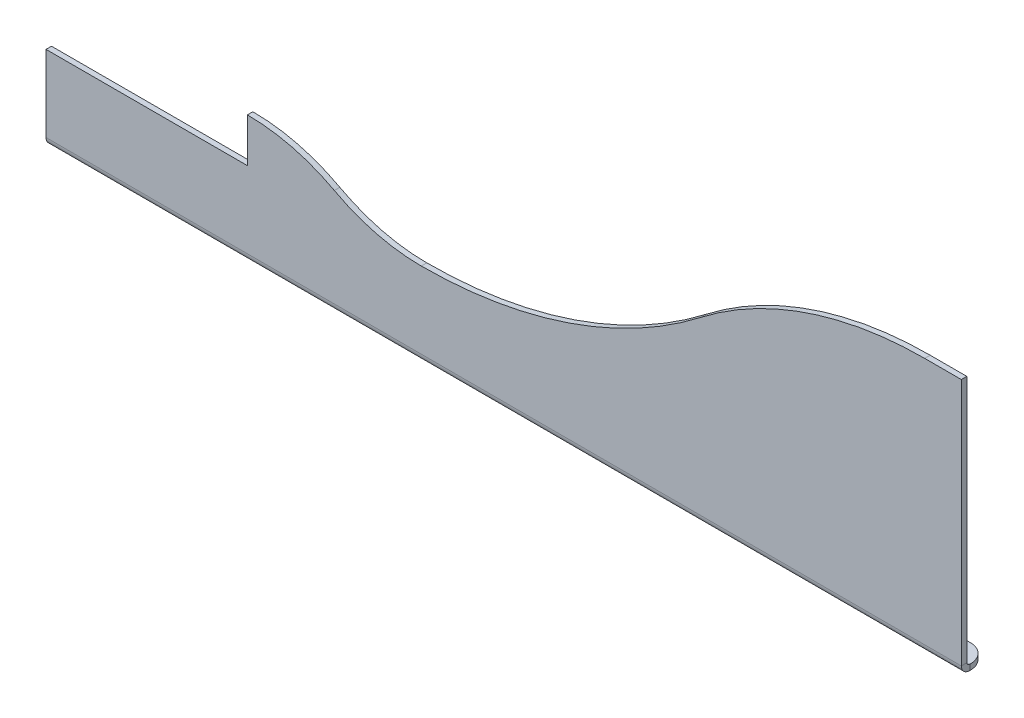
ISO-10303-21;
HEADER;
FILE_DESCRIPTION(('STEP AP214'),'2;1');
FILE_NAME('part.step','',(''),(''),'','','');
FILE_SCHEMA(('AUTOMOTIVE_DESIGN { 1 0 10303 214 1 1 1 1 }'));
ENDSEC;
DATA;
#1=APPLICATION_CONTEXT('core data for automotive mechanical design processes');
#2=APPLICATION_PROTOCOL_DEFINITION('international standard','automotive_design',2000,#1);
#3=PRODUCT_CONTEXT('',#1,'mechanical');
#4=PRODUCT('Part','Part','',(#3));
#5=PRODUCT_RELATED_PRODUCT_CATEGORY('part','',(#4));
#6=PRODUCT_DEFINITION_FORMATION('','',#4);
#7=PRODUCT_DEFINITION_CONTEXT('part definition',#1,'design');
#8=PRODUCT_DEFINITION('design','',#6,#7);
#9=PRODUCT_DEFINITION_SHAPE('','',#8);
#10=(LENGTH_UNIT() NAMED_UNIT(*) SI_UNIT(.MILLI.,.METRE.));
#11=(NAMED_UNIT(*) PLANE_ANGLE_UNIT() SI_UNIT($,.RADIAN.));
#12=(NAMED_UNIT(*) SI_UNIT($,.STERADIAN.) SOLID_ANGLE_UNIT());
#13=UNCERTAINTY_MEASURE_WITH_UNIT(LENGTH_MEASURE(1.E-05),#10,'distance_accuracy_value','');
#14=(GEOMETRIC_REPRESENTATION_CONTEXT(3) GLOBAL_UNCERTAINTY_ASSIGNED_CONTEXT((#13)) GLOBAL_UNIT_ASSIGNED_CONTEXT((#10,
#11,#12)) REPRESENTATION_CONTEXT('',''));
#15=CARTESIAN_POINT('',(0.,0.,0.));
#16=DIRECTION('',(0.,0.,1.));
#17=DIRECTION('',(1.,0.,0.));
#18=AXIS2_PLACEMENT_3D('',#15,#16,#17);
#19=CARTESIAN_POINT('',(-4.10775996457205,21.0198586262498,-3.00000000000002));
#20=DIRECTION('',(-1.,0.,0.));
#21=DIRECTION('',(0.,0.,1.));
#22=AXIS2_PLACEMENT_3D('',#19,#20,#21);
#23=PLANE('',#22);
#24=DIRECTION('',(0.,0.,-1.));
#25=VECTOR('',#24,1.);
#26=CARTESIAN_POINT('',(-4.10775996457205,24.0198586262498,-1.00613961606655E-13));
#27=LINE('',#26,#25);
#28=CARTESIAN_POINT('',(-4.10775996457205,24.0198586262498,-5.00000000000004));
#29=VERTEX_POINT('',#28);
#30=CARTESIAN_POINT('',(-4.10775996457202,24.0198586262498,-4.5));
#31=VERTEX_POINT('',#30);
#32=EDGE_CURVE('E221',#29,#31,#27,.F.);
#33=ORIENTED_EDGE('',*,*,#32,.F.);
#34=DIRECTION('',(0.,-1.,0.));
#35=VECTOR('',#34,1.);
#36=CARTESIAN_POINT('',(-4.10775996457205,21.0198586262498,-5.00000000000002));
#37=LINE('',#36,#35);
#38=CARTESIAN_POINT('',(-4.10775996457205,21.0198586262498,-5.00000000000002));
#39=VERTEX_POINT('',#38);
#40=EDGE_CURVE('E440',#29,#39,#37,.T.);
#41=ORIENTED_EDGE('',*,*,#40,.T.);
#42=DIRECTION('',(0.,0.,1.));
#43=VECTOR('',#42,1.);
#44=CARTESIAN_POINT('',(-4.10775996457205,21.0198586262498,-3.00000000000002));
#45=LINE('',#44,#43);
#46=CARTESIAN_POINT('',(-4.10775996457204,21.0198586262498,-4.50000000000002));
#47=VERTEX_POINT('',#46);
#48=EDGE_CURVE('E81',#39,#47,#45,.T.);
#49=ORIENTED_EDGE('',*,*,#48,.T.);
#50=DIRECTION('',(0.,-1.,0.));
#51=VECTOR('',#50,1.);
#52=CARTESIAN_POINT('',(-4.10775996457202,24.0198586262498,-4.50000000000004));
#53=LINE('',#52,#51);
#54=EDGE_CURVE('E219',#31,#47,#53,.T.);
#55=ORIENTED_EDGE('',*,*,#54,.F.);
#56=EDGE_LOOP('',(#33,#41,#49,#55));
#57=FACE_BOUND('',#56,.T.);
#58=ADVANCED_FACE('F59',(#57),#23,.T.);
#59=CARTESIAN_POINT('',(495.892240035428,21.0198586262497,-55.0000000000001));
#60=DIRECTION('',(1.,0.,0.));
#61=DIRECTION('',(0.,0.,-1.));
#62=AXIS2_PLACEMENT_3D('',#59,#60,#61);
#63=PLANE('',#62);
#64=DIRECTION('',(0.,0.,-1.));
#65=VECTOR('',#64,1.);
#66=CARTESIAN_POINT('',(495.892240035428,21.0198586262497,-55.0000000000001));
#67=LINE('',#66,#65);
#68=CARTESIAN_POINT('',(495.892240035428,21.0198586262498,-4.50000000000002));
#69=VERTEX_POINT('',#68);
#70=CARTESIAN_POINT('',(495.892240035428,21.0198586262498,-4.99999999999996));
#71=VERTEX_POINT('',#70);
#72=EDGE_CURVE('E74',#69,#71,#67,.T.);
#73=ORIENTED_EDGE('',*,*,#72,.T.);
#74=DIRECTION('',(0.,-1.,0.));
#75=VECTOR('',#74,1.);
#76=CARTESIAN_POINT('',(495.892240035428,24.0198586262498,-4.99999999999998));
#77=LINE('',#76,#75);
#78=CARTESIAN_POINT('',(495.892240035428,24.0198586262498,-4.99999999999998));
#79=VERTEX_POINT('',#78);
#80=EDGE_CURVE('E421',#71,#79,#77,.F.);
#81=ORIENTED_EDGE('',*,*,#80,.T.);
#82=DIRECTION('',(0.,0.,1.));
#83=VECTOR('',#82,1.);
#84=CARTESIAN_POINT('',(495.892240035428,24.0198586262498,-1.00613961606655E-13));
#85=LINE('',#84,#83);
#86=CARTESIAN_POINT('',(495.892240035428,24.0198586262498,-4.50000000000003));
#87=VERTEX_POINT('',#86);
#88=EDGE_CURVE('E388',#87,#79,#85,.F.);
#89=ORIENTED_EDGE('',*,*,#88,.F.);
#90=DIRECTION('',(0.,-1.,0.));
#91=VECTOR('',#90,1.);
#92=CARTESIAN_POINT('',(495.892240035428,21.0198586262498,-4.50000000000001));
#93=LINE('',#92,#91);
#94=EDGE_CURVE('E13',#87,#69,#93,.T.);
#95=ORIENTED_EDGE('',*,*,#94,.T.);
#96=EDGE_LOOP('',(#73,#81,#89,#95));
#97=FACE_BOUND('',#96,.T.);
#98=ADVANCED_FACE('F506',(#97),#63,.T.);
#99=CARTESIAN_POINT('',(0.,21.0198586262499,0.));
#100=DIRECTION('',(0.,-1.,0.));
#101=DIRECTION('',(0.,0.,-1.));
#102=AXIS2_PLACEMENT_3D('',#99,#100,#101);
#103=PLANE('',#102);
#104=DIRECTION('',(-1.,0.,0.));
#105=VECTOR('',#104,1.);
#106=CARTESIAN_POINT('',(495.892240035428,21.0198586262498,-15.));
#107=LINE('',#106,#105);
#108=CARTESIAN_POINT('',(485.892240035428,21.0198586262498,-15.));
#109=VERTEX_POINT('',#108);
#110=CARTESIAN_POINT('',(308.252919810426,21.0198586262498,-15.));
#111=VERTEX_POINT('',#110);
#112=EDGE_CURVE('E357',#109,#111,#107,.T.);
#113=ORIENTED_EDGE('',*,*,#112,.F.);
#114=CARTESIAN_POINT('',(485.892240035428,21.0198586262498,-4.99999999999997));
#115=DIRECTION('',(0.,-1.,0.));
#116=DIRECTION('',(0.,0.,-1.));
#117=AXIS2_PLACEMENT_3D('',#114,#115,#116);
#118=CIRCLE('',#117,10.);
#119=EDGE_CURVE('E419',#109,#71,#118,.T.);
#120=ORIENTED_EDGE('',*,*,#119,.T.);
#121=ORIENTED_EDGE('',*,*,#72,.F.);
#122=DIRECTION('',(-1.,0.,0.));
#123=VECTOR('',#122,1.);
#124=CARTESIAN_POINT('',(0.,21.0198586262498,-4.50000000000002));
#125=LINE('',#124,#123);
#126=EDGE_CURVE('E67',#69,#47,#125,.T.);
#127=ORIENTED_EDGE('',*,*,#126,.T.);
#128=ORIENTED_EDGE('',*,*,#48,.F.);
#129=CARTESIAN_POINT('',(5.89224003542795,21.0198586262498,-5.00000000000002));
#130=DIRECTION('',(0.,-1.,0.));
#131=DIRECTION('',(0.,0.,-1.));
#132=AXIS2_PLACEMENT_3D('',#129,#130,#131);
#133=CIRCLE('',#132,10.);
#134=CARTESIAN_POINT('',(5.89224003542795,21.0198586262498,-15.));
#135=VERTEX_POINT('',#134);
#136=EDGE_CURVE('E413',#39,#135,#133,.T.);
#137=ORIENTED_EDGE('',*,*,#136,.T.);
#138=DIRECTION('',(-1.,0.,0.));
#139=VECTOR('',#138,1.);
#140=CARTESIAN_POINT('',(-4.10775996457205,21.0198586262498,-15.));
#141=LINE('',#140,#139);
#142=CARTESIAN_POINT('',(183.53156026043,21.0198586262498,-15.));
#143=VERTEX_POINT('',#142);
#144=EDGE_CURVE('E343',#143,#135,#141,.T.);
#145=ORIENTED_EDGE('',*,*,#144,.F.);
#146=CARTESIAN_POINT('',(183.53156026043,21.0198586262497,-35.));
#147=DIRECTION('',(0.,-1.,0.));
#148=DIRECTION('',(0.,0.,-1.));
#149=AXIS2_PLACEMENT_3D('',#146,#147,#148);
#150=CIRCLE('',#149,20.);
#151=CARTESIAN_POINT('',(201.420104080428,21.0198586262498,-26.0557280900009));
#152=VERTEX_POINT('',#151);
#153=EDGE_CURVE('E339',#152,#143,#150,.T.);
#154=ORIENTED_EDGE('',*,*,#153,.F.);
#155=DIRECTION('',(-0.447213595499958,0.,0.894427190999916));
#156=VECTOR('',#155,1.);
#157=CARTESIAN_POINT('',(201.420104080428,21.0198586262498,-26.0557280900009));
#158=LINE('',#157,#156);
#159=CARTESIAN_POINT('',(213.128308012928,21.0198586262497,-49.4721359549997));
#160=VERTEX_POINT('',#159);
#161=EDGE_CURVE('E337',#160,#152,#158,.T.);
#162=ORIENTED_EDGE('',*,*,#161,.F.);
#163=CARTESIAN_POINT('',(222.072579922927,21.0198586262497,-45.0000000000001));
#164=DIRECTION('',(0.,-1.,0.));
#165=DIRECTION('',(0.,0.,-1.));
#166=AXIS2_PLACEMENT_3D('',#163,#164,#165);
#167=CIRCLE('',#166,10.);
#168=CARTESIAN_POINT('',(222.072579922927,21.0198586262497,-55.0000000000001));
#169=VERTEX_POINT('',#168);
#170=EDGE_CURVE('E415',#160,#169,#167,.T.);
#171=ORIENTED_EDGE('',*,*,#170,.T.);
#172=DIRECTION('',(-1.,0.,0.));
#173=VECTOR('',#172,1.);
#174=CARTESIAN_POINT('',(-4.10775996457205,21.0198586262497,-55.));
#175=LINE('',#174,#173);
#176=CARTESIAN_POINT('',(269.711900147929,21.0198586262497,-55.0000000000001));
#177=VERTEX_POINT('',#176);
#178=EDGE_CURVE('E382',#177,#169,#175,.T.);
#179=ORIENTED_EDGE('',*,*,#178,.F.);
#180=CARTESIAN_POINT('',(269.711900147929,21.0198586262497,-45.0000000000001));
#181=DIRECTION('',(0.,-1.,0.));
#182=DIRECTION('',(0.,0.,-1.));
#183=AXIS2_PLACEMENT_3D('',#180,#181,#182);
#184=CIRCLE('',#183,10.);
#185=CARTESIAN_POINT('',(278.656172057928,21.0198586262497,-49.4721359549996));
#186=VERTEX_POINT('',#185);
#187=EDGE_CURVE('E417',#177,#186,#184,.T.);
#188=ORIENTED_EDGE('',*,*,#187,.T.);
#189=DIRECTION('',(-0.447213595499958,0.,-0.894427190999916));
#190=VECTOR('',#189,1.);
#191=CARTESIAN_POINT('',(290.364375990428,21.0198586262498,-26.0557280900009));
#192=LINE('',#191,#190);
#193=CARTESIAN_POINT('',(290.364375990428,21.0198586262498,-26.0557280900009));
#194=VERTEX_POINT('',#193);
#195=EDGE_CURVE('E354',#194,#186,#192,.T.);
#196=ORIENTED_EDGE('',*,*,#195,.F.);
#197=CARTESIAN_POINT('',(308.252919810426,21.0198586262497,-35.));
#198=DIRECTION('',(0.,-1.,0.));
#199=DIRECTION('',(0.,0.,1.));
#200=AXIS2_PLACEMENT_3D('',#197,#198,#199);
#201=CIRCLE('',#200,20.);
#202=EDGE_CURVE('E263',#111,#194,#201,.T.);
#203=ORIENTED_EDGE('',*,*,#202,.F.);
#204=EDGE_LOOP('',(#113,#120,#121,#127,#128,#137,#145,#154,#162,#171,#179,#188,#196,#203));
#205=FACE_BOUND('',#204,.T.);
#206=CARTESIAN_POINT('',(228.214570505764,21.0198586262498,-12.0723304703364));
#207=DIRECTION('',(0.,-1.,0.));
#208=DIRECTION('',(0.,0.,-1.));
#209=AXIS2_PLACEMENT_3D('',#206,#207,#208);
#210=CIRCLE('',#209,3.09999999999993);
#211=CARTESIAN_POINT('',(228.214570505764,21.0198586262498,-15.1723304703363));
#212=VERTEX_POINT('',#211);
#213=EDGE_CURVE('E371',#212,#212,#210,.T.);
#214=ORIENTED_EDGE('',*,*,#213,.F.);
#215=EDGE_LOOP('',(#214));
#216=FACE_BOUND('',#215,.T.);
#217=CARTESIAN_POINT('',(263.569909565092,21.0198586262497,-47.4276695296637));
#218=DIRECTION('',(0.,-1.,0.));
#219=DIRECTION('',(0.,0.,1.));
#220=AXIS2_PLACEMENT_3D('',#217,#218,#219);
#221=CIRCLE('',#220,3.09999999999993);
#222=CARTESIAN_POINT('',(263.569909565092,21.0198586262497,-44.3276695296638));
#223=VERTEX_POINT('',#222);
#224=EDGE_CURVE('E370',#223,#223,#221,.T.);
#225=ORIENTED_EDGE('',*,*,#224,.F.);
#226=EDGE_LOOP('',(#225));
#227=FACE_BOUND('',#226,.T.);
#228=CARTESIAN_POINT('',(228.214570505764,21.0198586262497,-47.4276695296637));
#229=DIRECTION('',(0.,-1.,0.));
#230=DIRECTION('',(0.,0.,1.));
#231=AXIS2_PLACEMENT_3D('',#228,#229,#230);
#232=CIRCLE('',#231,3.09999999999999);
#233=CARTESIAN_POINT('',(228.214570505764,21.0198586262497,-44.3276695296638));
#234=VERTEX_POINT('',#233);
#235=EDGE_CURVE('E367',#234,#234,#232,.T.);
#236=ORIENTED_EDGE('',*,*,#235,.F.);
#237=EDGE_LOOP('',(#236));
#238=FACE_BOUND('',#237,.T.);
#239=CARTESIAN_POINT('',(263.569909565092,21.0198586262498,-12.0723304703364));
#240=DIRECTION('',(0.,-1.,0.));
#241=DIRECTION('',(0.,0.,-1.));
#242=AXIS2_PLACEMENT_3D('',#239,#240,#241);
#243=CIRCLE('',#242,3.09999999999993);
#244=CARTESIAN_POINT('',(263.569909565092,21.0198586262498,-15.1723304703363));
#245=VERTEX_POINT('',#244);
#246=EDGE_CURVE('E374',#245,#245,#243,.T.);
#247=ORIENTED_EDGE('',*,*,#246,.F.);
#248=EDGE_LOOP('',(#247));
#249=FACE_BOUND('',#248,.T.);
#250=ADVANCED_FACE('F444',(#205,#216,#227,#238,#249),#103,.T.);
#251=CARTESIAN_POINT('',(0.,24.0198586262498,-1.00613961606655E-13));
#252=DIRECTION('',(0.,-1.,0.));
#253=DIRECTION('',(0.,0.,-1.));
#254=AXIS2_PLACEMENT_3D('',#251,#252,#253);
#255=PLANE('',#254);
#256=CARTESIAN_POINT('',(228.214570505764,24.0198586262498,-12.0723304703364));
#257=DIRECTION('',(0.,-1.,0.));
#258=DIRECTION('',(0.,0.,-1.));
#259=AXIS2_PLACEMENT_3D('',#256,#257,#258);
#260=CIRCLE('',#259,3.09999999999993);
#261=CARTESIAN_POINT('',(228.214570505764,24.0198586262498,-15.1723304703363));
#262=VERTEX_POINT('',#261);
#263=EDGE_CURVE('E390',#262,#262,#260,.T.);
#264=ORIENTED_EDGE('',*,*,#263,.T.);
#265=EDGE_LOOP('',(#264));
#266=FACE_BOUND('',#265,.T.);
#267=CARTESIAN_POINT('',(263.569909565092,24.0198586262497,-47.4276695296637));
#268=DIRECTION('',(0.,-1.,0.));
#269=DIRECTION('',(0.,0.,-1.));
#270=AXIS2_PLACEMENT_3D('',#267,#268,#269);
#271=CIRCLE('',#270,3.09999999999993);
#272=CARTESIAN_POINT('',(263.569909565092,24.0198586262497,-50.5276695296636));
#273=VERTEX_POINT('',#272);
#274=EDGE_CURVE('E396',#273,#273,#271,.T.);
#275=ORIENTED_EDGE('',*,*,#274,.T.);
#276=EDGE_LOOP('',(#275));
#277=FACE_BOUND('',#276,.T.);
#278=CARTESIAN_POINT('',(228.214570505764,24.0198586262497,-47.4276695296637));
#279=DIRECTION('',(0.,-1.,0.));
#280=DIRECTION('',(0.,0.,-1.));
#281=AXIS2_PLACEMENT_3D('',#278,#279,#280);
#282=CIRCLE('',#281,3.09999999999999);
#283=CARTESIAN_POINT('',(228.214570505764,24.0198586262497,-50.5276695296637));
#284=VERTEX_POINT('',#283);
#285=EDGE_CURVE('E393',#284,#284,#282,.T.);
#286=ORIENTED_EDGE('',*,*,#285,.T.);
#287=EDGE_LOOP('',(#286));
#288=FACE_BOUND('',#287,.T.);
#289=CARTESIAN_POINT('',(263.569909565092,24.0198586262498,-12.0723304703364));
#290=DIRECTION('',(0.,-1.,0.));
#291=DIRECTION('',(0.,0.,-1.));
#292=AXIS2_PLACEMENT_3D('',#289,#290,#291);
#293=CIRCLE('',#292,3.09999999999993);
#294=CARTESIAN_POINT('',(263.569909565092,24.0198586262498,-15.1723304703363));
#295=VERTEX_POINT('',#294);
#296=EDGE_CURVE('E379',#295,#295,#293,.T.);
#297=ORIENTED_EDGE('',*,*,#296,.T.);
#298=EDGE_LOOP('',(#297));
#299=FACE_BOUND('',#298,.T.);
#300=ORIENTED_EDGE('',*,*,#88,.T.);
#301=CARTESIAN_POINT('',(485.892240035428,24.0198586262498,-4.99999999999998));
#302=DIRECTION('',(0.,-1.,0.));
#303=DIRECTION('',(0.,0.,-1.));
#304=AXIS2_PLACEMENT_3D('',#301,#302,#303);
#305=CIRCLE('',#304,10.);
#306=CARTESIAN_POINT('',(485.892240035428,24.0198586262498,-15.));
#307=VERTEX_POINT('',#306);
#308=EDGE_CURVE('E428',#79,#307,#305,.F.);
#309=ORIENTED_EDGE('',*,*,#308,.T.);
#310=DIRECTION('',(-1.,0.,0.));
#311=VECTOR('',#310,1.);
#312=CARTESIAN_POINT('',(0.,24.0198586262498,-15.0000000000001));
#313=LINE('',#312,#311);
#314=CARTESIAN_POINT('',(308.252919810426,24.0198586262498,-15.));
#315=VERTEX_POINT('',#314);
#316=EDGE_CURVE('E403',#307,#315,#313,.T.);
#317=ORIENTED_EDGE('',*,*,#316,.T.);
#318=CARTESIAN_POINT('',(308.252919810426,24.0198586262497,-35.));
#319=DIRECTION('',(0.,-1.,0.));
#320=DIRECTION('',(0.,0.,-1.));
#321=AXIS2_PLACEMENT_3D('',#318,#319,#320);
#322=CIRCLE('',#321,20.);
#323=CARTESIAN_POINT('',(290.364375990428,24.0198586262497,-26.0557280900009));
#324=VERTEX_POINT('',#323);
#325=EDGE_CURVE('E381',#315,#324,#322,.T.);
#326=ORIENTED_EDGE('',*,*,#325,.T.);
#327=DIRECTION('',(-0.447213595499958,0.,-0.894427190999916));
#328=VECTOR('',#327,1.);
#329=CARTESIAN_POINT('',(242.713792028342,24.0198586262494,-121.356896014171));
#330=LINE('',#329,#328);
#331=CARTESIAN_POINT('',(278.656172057928,24.0198586262497,-49.4721359549996));
#332=VERTEX_POINT('',#331);
#333=EDGE_CURVE('E349',#324,#332,#330,.T.);
#334=ORIENTED_EDGE('',*,*,#333,.T.);
#335=CARTESIAN_POINT('',(269.711900147929,24.0198586262497,-45.0000000000001));
#336=DIRECTION('',(0.,-1.,0.));
#337=DIRECTION('',(0.,0.,-1.));
#338=AXIS2_PLACEMENT_3D('',#335,#336,#337);
#339=CIRCLE('',#338,10.);
#340=CARTESIAN_POINT('',(269.711900147929,24.0198586262497,-55.0000000000001));
#341=VERTEX_POINT('',#340);
#342=EDGE_CURVE('E426',#332,#341,#339,.F.);
#343=ORIENTED_EDGE('',*,*,#342,.T.);
#344=DIRECTION('',(1.,0.,0.));
#345=VECTOR('',#344,1.);
#346=CARTESIAN_POINT('',(0.,24.0198586262497,-55.));
#347=LINE('',#346,#345);
#348=CARTESIAN_POINT('',(222.072579922927,24.0198586262497,-55.0000000000001));
#349=VERTEX_POINT('',#348);
#350=EDGE_CURVE('E236',#341,#349,#347,.F.);
#351=ORIENTED_EDGE('',*,*,#350,.T.);
#352=CARTESIAN_POINT('',(222.072579922927,24.0198586262497,-45.0000000000001));
#353=DIRECTION('',(0.,-1.,0.));
#354=DIRECTION('',(0.,0.,-1.));
#355=AXIS2_PLACEMENT_3D('',#352,#353,#354);
#356=CIRCLE('',#355,10.);
#357=CARTESIAN_POINT('',(213.128308012928,24.0198586262497,-49.4721359549997));
#358=VERTEX_POINT('',#357);
#359=EDGE_CURVE('E424',#349,#358,#356,.F.);
#360=ORIENTED_EDGE('',*,*,#359,.T.);
#361=DIRECTION('',(-0.447213595499958,0.,0.894427190999916));
#362=VECTOR('',#361,1.);
#363=CARTESIAN_POINT('',(150.713792028342,24.0198586262501,75.3568960141711));
#364=LINE('',#363,#362);
#365=CARTESIAN_POINT('',(201.420104080428,24.0198586262497,-26.0557280900009));
#366=VERTEX_POINT('',#365);
#367=EDGE_CURVE('E365',#358,#366,#364,.T.);
#368=ORIENTED_EDGE('',*,*,#367,.T.);
#369=CARTESIAN_POINT('',(183.53156026043,24.0198586262497,-35.));
#370=DIRECTION('',(0.,-1.,0.));
#371=DIRECTION('',(0.,0.,-1.));
#372=AXIS2_PLACEMENT_3D('',#369,#370,#371);
#373=CIRCLE('',#372,20.);
#374=CARTESIAN_POINT('',(183.53156026043,24.0198586262496,-15.));
#375=VERTEX_POINT('',#374);
#376=EDGE_CURVE('E405',#366,#375,#373,.T.);
#377=ORIENTED_EDGE('',*,*,#376,.T.);
#378=DIRECTION('',(-1.,0.,0.));
#379=VECTOR('',#378,1.);
#380=CARTESIAN_POINT('',(0.,24.0198586262498,-15.));
#381=LINE('',#380,#379);
#382=CARTESIAN_POINT('',(5.89224003542795,24.0198586262498,-15.));
#383=VERTEX_POINT('',#382);
#384=EDGE_CURVE('E408',#375,#383,#381,.T.);
#385=ORIENTED_EDGE('',*,*,#384,.T.);
#386=CARTESIAN_POINT('',(5.89224003542795,24.0198586262498,-5.00000000000004));
#387=DIRECTION('',(0.,-1.,0.));
#388=DIRECTION('',(0.,0.,-1.));
#389=AXIS2_PLACEMENT_3D('',#386,#387,#388);
#390=CIRCLE('',#389,10.);
#391=EDGE_CURVE('E235',#383,#29,#390,.F.);
#392=ORIENTED_EDGE('',*,*,#391,.T.);
#393=ORIENTED_EDGE('',*,*,#32,.T.);
#394=DIRECTION('',(-1.,0.,0.));
#395=VECTOR('',#394,1.);
#396=CARTESIAN_POINT('',(495.892240035428,24.0198586262498,-4.50000000000002));
#397=LINE('',#396,#395);
#398=EDGE_CURVE('E226',#87,#31,#397,.T.);
#399=ORIENTED_EDGE('',*,*,#398,.F.);
#400=EDGE_LOOP('',(#300,#309,#317,#326,#334,#343,#351,#360,#368,#377,#385,#392,#393,#399));
#401=FACE_BOUND('',#400,.T.);
#402=ADVANCED_FACE('F231',(#266,#277,#288,#299,#401),#255,.F.);
#403=CARTESIAN_POINT('',(-4.10775996457205,21.0198586262497,-55.));
#404=DIRECTION('',(0.,0.,-1.));
#405=DIRECTION('',(0.,1.,0.));
#406=AXIS2_PLACEMENT_3D('',#403,#404,#405);
#407=PLANE('',#406);
#408=ORIENTED_EDGE('',*,*,#350,.F.);
#409=DIRECTION('',(0.,1.,0.));
#410=VECTOR('',#409,1.);
#411=CARTESIAN_POINT('',(269.711900147929,21.0198586262497,-55.0000000000001));
#412=LINE('',#411,#410);
#413=EDGE_CURVE('E435',#341,#177,#412,.F.);
#414=ORIENTED_EDGE('',*,*,#413,.T.);
#415=ORIENTED_EDGE('',*,*,#178,.T.);
#416=DIRECTION('',(0.,-1.,0.));
#417=VECTOR('',#416,1.);
#418=CARTESIAN_POINT('',(222.072579922927,24.0198586262497,-55.0000000000001));
#419=LINE('',#418,#417);
#420=EDGE_CURVE('E433',#169,#349,#419,.F.);
#421=ORIENTED_EDGE('',*,*,#420,.T.);
#422=EDGE_LOOP('',(#408,#414,#415,#421));
#423=FACE_BOUND('',#422,.T.);
#424=ADVANCED_FACE('F516',(#423),#407,.T.);
#425=CARTESIAN_POINT('',(263.569909565092,161.01985862625,-12.0723304703369));
#426=DIRECTION('',(0.,-1.,0.));
#427=DIRECTION('',(0.,0.,-1.));
#428=AXIS2_PLACEMENT_3D('',#425,#426,#427);
#429=CYLINDRICAL_SURFACE('',#428,3.09999999999993);
#430=ORIENTED_EDGE('',*,*,#246,.T.);
#431=EDGE_LOOP('',(#430));
#432=FACE_BOUND('',#431,.T.);
#433=ORIENTED_EDGE('',*,*,#296,.F.);
#434=EDGE_LOOP('',(#433));
#435=FACE_BOUND('',#434,.T.);
#436=ADVANCED_FACE('F518',(#432,#435),#429,.F.);
#437=CARTESIAN_POINT('',(228.214570505764,161.01985862625,-47.4276695296642));
#438=DIRECTION('',(0.,-1.,0.));
#439=DIRECTION('',(0.,0.,-1.));
#440=AXIS2_PLACEMENT_3D('',#437,#438,#439);
#441=CYLINDRICAL_SURFACE('',#440,3.09999999999999);
#442=ORIENTED_EDGE('',*,*,#235,.T.);
#443=EDGE_LOOP('',(#442));
#444=FACE_BOUND('',#443,.T.);
#445=ORIENTED_EDGE('',*,*,#285,.F.);
#446=EDGE_LOOP('',(#445));
#447=FACE_BOUND('',#446,.T.);
#448=ADVANCED_FACE('F574',(#444,#447),#441,.F.);
#449=CARTESIAN_POINT('',(263.569909565092,161.01985862625,-47.4276695296642));
#450=DIRECTION('',(0.,-1.,0.));
#451=DIRECTION('',(0.,0.,-1.));
#452=AXIS2_PLACEMENT_3D('',#449,#450,#451);
#453=CYLINDRICAL_SURFACE('',#452,3.09999999999993);
#454=ORIENTED_EDGE('',*,*,#224,.T.);
#455=EDGE_LOOP('',(#454));
#456=FACE_BOUND('',#455,.T.);
#457=ORIENTED_EDGE('',*,*,#274,.F.);
#458=EDGE_LOOP('',(#457));
#459=FACE_BOUND('',#458,.T.);
#460=ADVANCED_FACE('F577',(#456,#459),#453,.F.);
#461=CARTESIAN_POINT('',(228.214570505764,161.01985862625,-12.0723304703368));
#462=DIRECTION('',(0.,-1.,0.));
#463=DIRECTION('',(0.,0.,-1.));
#464=AXIS2_PLACEMENT_3D('',#461,#462,#463);
#465=CYLINDRICAL_SURFACE('',#464,3.09999999999993);
#466=ORIENTED_EDGE('',*,*,#213,.T.);
#467=EDGE_LOOP('',(#466));
#468=FACE_BOUND('',#467,.T.);
#469=ORIENTED_EDGE('',*,*,#263,.F.);
#470=EDGE_LOOP('',(#469));
#471=FACE_BOUND('',#470,.T.);
#472=ADVANCED_FACE('F572',(#468,#471),#465,.F.);
#473=CARTESIAN_POINT('',(308.252919810426,161.01985862625,-35.0000000000005));
#474=DIRECTION('',(0.,-1.,0.));
#475=DIRECTION('',(0.,0.,-1.));
#476=AXIS2_PLACEMENT_3D('',#473,#474,#475);
#477=CYLINDRICAL_SURFACE('',#476,20.);
#478=DIRECTION('',(0.,-1.,0.));
#479=VECTOR('',#478,1.);
#480=CARTESIAN_POINT('',(308.252919810426,161.01985862625,-15.0000000000005));
#481=LINE('',#480,#479);
#482=EDGE_CURVE('E340',#315,#111,#481,.T.);
#483=ORIENTED_EDGE('',*,*,#482,.T.);
#484=ORIENTED_EDGE('',*,*,#202,.T.);
#485=DIRECTION('',(0.,-1.,0.));
#486=VECTOR('',#485,1.);
#487=CARTESIAN_POINT('',(290.364375990428,161.01985862625,-26.0557280900013));
#488=LINE('',#487,#486);
#489=EDGE_CURVE('E359',#324,#194,#488,.T.);
#490=ORIENTED_EDGE('',*,*,#489,.F.);
#491=ORIENTED_EDGE('',*,*,#325,.F.);
#492=EDGE_LOOP('',(#483,#484,#490,#491));
#493=FACE_BOUND('',#492,.T.);
#494=ADVANCED_FACE('F567',(#493),#477,.F.);
#495=CARTESIAN_POINT('',(495.892240035428,161.01985862625,-15.0000000000005));
#496=DIRECTION('',(0.,0.,1.));
#497=DIRECTION('',(0.,-1.,0.));
#498=AXIS2_PLACEMENT_3D('',#495,#496,#497);
#499=PLANE('',#498);
#500=ORIENTED_EDGE('',*,*,#316,.F.);
#501=DIRECTION('',(0.,-1.,0.));
#502=VECTOR('',#501,1.);
#503=CARTESIAN_POINT('',(485.892240035428,21.0198586262498,-15.));
#504=LINE('',#503,#502);
#505=EDGE_CURVE('E410',#307,#109,#504,.T.);
#506=ORIENTED_EDGE('',*,*,#505,.T.);
#507=ORIENTED_EDGE('',*,*,#112,.T.);
#508=ORIENTED_EDGE('',*,*,#482,.F.);
#509=EDGE_LOOP('',(#500,#506,#507,#508));
#510=FACE_BOUND('',#509,.T.);
#511=ADVANCED_FACE('F558',(#510),#499,.F.);
#512=CARTESIAN_POINT('',(290.364375990428,161.01985862625,-26.0557280900013));
#513=DIRECTION('',(-0.894427190999916,0.,0.447213595499958));
#514=DIRECTION('',(0.447213595499958,0.,0.894427190999916));
#515=AXIS2_PLACEMENT_3D('',#512,#513,#514);
#516=PLANE('',#515);
#517=ORIENTED_EDGE('',*,*,#195,.T.);
#518=DIRECTION('',(0.,1.,0.));
#519=VECTOR('',#518,1.);
#520=CARTESIAN_POINT('',(278.656172057928,24.0198586262497,-49.4721359549996));
#521=LINE('',#520,#519);
#522=EDGE_CURVE('E430',#186,#332,#521,.T.);
#523=ORIENTED_EDGE('',*,*,#522,.T.);
#524=ORIENTED_EDGE('',*,*,#333,.F.);
#525=ORIENTED_EDGE('',*,*,#489,.T.);
#526=EDGE_LOOP('',(#517,#523,#524,#525));
#527=FACE_BOUND('',#526,.T.);
#528=ADVANCED_FACE('F551',(#527),#516,.F.);
#529=CARTESIAN_POINT('',(-4.10775996457205,161.01985862625,-15.0000000000005));
#530=DIRECTION('',(0.,0.,1.));
#531=DIRECTION('',(0.,-1.,0.));
#532=AXIS2_PLACEMENT_3D('',#529,#530,#531);
#533=PLANE('',#532);
#534=ORIENTED_EDGE('',*,*,#144,.T.);
#535=DIRECTION('',(0.,-1.,0.));
#536=VECTOR('',#535,1.);
#537=CARTESIAN_POINT('',(5.89224003542795,24.0198586262498,-15.));
#538=LINE('',#537,#536);
#539=EDGE_CURVE('E246',#135,#383,#538,.F.);
#540=ORIENTED_EDGE('',*,*,#539,.T.);
#541=ORIENTED_EDGE('',*,*,#384,.F.);
#542=DIRECTION('',(0.,-1.,0.));
#543=VECTOR('',#542,1.);
#544=CARTESIAN_POINT('',(183.53156026043,161.01985862625,-15.0000000000005));
#545=LINE('',#544,#543);
#546=EDGE_CURVE('E347',#375,#143,#545,.T.);
#547=ORIENTED_EDGE('',*,*,#546,.T.);
#548=EDGE_LOOP('',(#534,#540,#541,#547));
#549=FACE_BOUND('',#548,.T.);
#550=ADVANCED_FACE('F549',(#549),#533,.F.);
#551=CARTESIAN_POINT('',(183.53156026043,161.01985862625,-35.0000000000005));
#552=DIRECTION('',(0.,-1.,0.));
#553=DIRECTION('',(0.,0.,-1.));
#554=AXIS2_PLACEMENT_3D('',#551,#552,#553);
#555=CYLINDRICAL_SURFACE('',#554,20.);
#556=DIRECTION('',(0.,-1.,0.));
#557=VECTOR('',#556,1.);
#558=CARTESIAN_POINT('',(201.420104080428,161.01985862625,-26.0557280900014));
#559=LINE('',#558,#557);
#560=EDGE_CURVE('E346',#366,#152,#559,.T.);
#561=ORIENTED_EDGE('',*,*,#560,.T.);
#562=ORIENTED_EDGE('',*,*,#153,.T.);
#563=ORIENTED_EDGE('',*,*,#546,.F.);
#564=ORIENTED_EDGE('',*,*,#376,.F.);
#565=EDGE_LOOP('',(#561,#562,#563,#564));
#566=FACE_BOUND('',#565,.T.);
#567=ADVANCED_FACE('F544',(#566),#555,.F.);
#568=CARTESIAN_POINT('',(201.420104080428,161.01985862625,-26.0557280900014));
#569=DIRECTION('',(0.894427190999916,0.,0.447213595499958));
#570=DIRECTION('',(0.447213595499958,0.,-0.894427190999916));
#571=AXIS2_PLACEMENT_3D('',#568,#569,#570);
#572=PLANE('',#571);
#573=ORIENTED_EDGE('',*,*,#367,.F.);
#574=DIRECTION('',(0.,-1.,0.));
#575=VECTOR('',#574,1.);
#576=CARTESIAN_POINT('',(213.128308012928,21.0198586262497,-49.4721359549997));
#577=LINE('',#576,#575);
#578=EDGE_CURVE('E437',#358,#160,#577,.T.);
#579=ORIENTED_EDGE('',*,*,#578,.T.);
#580=ORIENTED_EDGE('',*,*,#161,.T.);
#581=ORIENTED_EDGE('',*,*,#560,.F.);
#582=EDGE_LOOP('',(#573,#579,#580,#581));
#583=FACE_BOUND('',#582,.T.);
#584=ADVANCED_FACE('F525',(#583),#572,.F.);
#585=CARTESIAN_POINT('',(485.892240035428,161.01985862625,-5.00000000000046));
#586=DIRECTION('',(0.,1.,0.));
#587=DIRECTION('',(0.,0.,1.));
#588=AXIS2_PLACEMENT_3D('',#585,#586,#587);
#589=CYLINDRICAL_SURFACE('',#588,10.);
#590=ORIENTED_EDGE('',*,*,#308,.F.);
#591=ORIENTED_EDGE('',*,*,#80,.F.);
#592=ORIENTED_EDGE('',*,*,#119,.F.);
#593=ORIENTED_EDGE('',*,*,#505,.F.);
#594=EDGE_LOOP('',(#590,#591,#592,#593));
#595=FACE_BOUND('',#594,.T.);
#596=ADVANCED_FACE('F521',(#595),#589,.T.);
#597=CARTESIAN_POINT('',(269.711900147929,161.01985862625,-45.0000000000006));
#598=DIRECTION('',(0.,-1.,0.));
#599=DIRECTION('',(0.,0.,-1.));
#600=AXIS2_PLACEMENT_3D('',#597,#598,#599);
#601=CYLINDRICAL_SURFACE('',#600,10.);
#602=ORIENTED_EDGE('',*,*,#187,.F.);
#603=ORIENTED_EDGE('',*,*,#413,.F.);
#604=ORIENTED_EDGE('',*,*,#342,.F.);
#605=ORIENTED_EDGE('',*,*,#522,.F.);
#606=EDGE_LOOP('',(#602,#603,#604,#605));
#607=FACE_BOUND('',#606,.T.);
#608=ADVANCED_FACE('F524',(#607),#601,.T.);
#609=CARTESIAN_POINT('',(222.072579922927,161.01985862625,-45.0000000000006));
#610=DIRECTION('',(0.,1.,0.));
#611=DIRECTION('',(0.,0.,1.));
#612=AXIS2_PLACEMENT_3D('',#609,#610,#611);
#613=CYLINDRICAL_SURFACE('',#612,10.);
#614=ORIENTED_EDGE('',*,*,#359,.F.);
#615=ORIENTED_EDGE('',*,*,#420,.F.);
#616=ORIENTED_EDGE('',*,*,#170,.F.);
#617=ORIENTED_EDGE('',*,*,#578,.F.);
#618=EDGE_LOOP('',(#614,#615,#616,#617));
#619=FACE_BOUND('',#618,.T.);
#620=ADVANCED_FACE('F502',(#619),#613,.T.);
#621=CARTESIAN_POINT('',(5.89224003542795,21.0198586262498,-5.00000000000002));
#622=DIRECTION('',(0.,1.,0.));
#623=DIRECTION('',(0.,0.,1.));
#624=AXIS2_PLACEMENT_3D('',#621,#622,#623);
#625=CYLINDRICAL_SURFACE('',#624,10.);
#626=ORIENTED_EDGE('',*,*,#391,.F.);
#627=ORIENTED_EDGE('',*,*,#539,.F.);
#628=ORIENTED_EDGE('',*,*,#136,.F.);
#629=ORIENTED_EDGE('',*,*,#40,.F.);
#630=EDGE_LOOP('',(#626,#627,#628,#629));
#631=FACE_BOUND('',#630,.T.);
#632=ADVANCED_FACE('F61',(#631),#625,.T.);
#633=CARTESIAN_POINT('',(495.892240035428,161.01985862625,-3.));
#634=DIRECTION('',(0.,1.,0.));
#635=DIRECTION('',(0.,0.,1.));
#636=AXIS2_PLACEMENT_3D('',#633,#634,#635);
#637=PLANE('',#636);
#638=DIRECTION('',(-1.,0.,0.));
#639=VECTOR('',#638,1.);
#640=CARTESIAN_POINT('',(495.892240035428,161.01985862625,0.));
#641=LINE('',#640,#639);
#642=CARTESIAN_POINT('',(495.892240035428,161.01985862625,0.));
#643=VERTEX_POINT('',#642);
#644=CARTESIAN_POINT('',(475.892240035428,161.01985862625,0.));
#645=VERTEX_POINT('',#644);
#646=EDGE_CURVE('E284',#643,#645,#641,.T.);
#647=ORIENTED_EDGE('',*,*,#646,.F.);
#648=DIRECTION('',(0.,0.,1.));
#649=VECTOR('',#648,1.);
#650=CARTESIAN_POINT('',(495.892240035428,161.01985862625,-3.));
#651=LINE('',#650,#649);
#652=CARTESIAN_POINT('',(495.892240035428,161.01985862625,-3.));
#653=VERTEX_POINT('',#652);
#654=EDGE_CURVE('E260',#653,#643,#651,.T.);
#655=ORIENTED_EDGE('',*,*,#654,.F.);
#656=DIRECTION('',(-1.,0.,0.));
#657=VECTOR('',#656,1.);
#658=CARTESIAN_POINT('',(495.892240035428,161.01985862625,-3.));
#659=LINE('',#658,#657);
#660=CARTESIAN_POINT('',(475.892240035428,161.01985862625,-3.));
#661=VERTEX_POINT('',#660);
#662=EDGE_CURVE('E331',#653,#661,#659,.T.);
#663=ORIENTED_EDGE('',*,*,#662,.T.);
#664=DIRECTION('',(0.,0.,1.));
#665=VECTOR('',#664,1.);
#666=CARTESIAN_POINT('',(475.892240035428,161.01985862625,-3.));
#667=LINE('',#666,#665);
#668=EDGE_CURVE('E329',#661,#645,#667,.T.);
#669=ORIENTED_EDGE('',*,*,#668,.T.);
#670=EDGE_LOOP('',(#647,#655,#663,#669));
#671=FACE_BOUND('',#670,.T.);
#672=ADVANCED_FACE('F494',(#671),#637,.T.);
#673=CARTESIAN_POINT('',(475.892240035428,-38.9801413737502,-3.));
#674=DIRECTION('',(0.,0.,1.));
#675=DIRECTION('',(1.,0.,0.));
#676=AXIS2_PLACEMENT_3D('',#673,#674,#675);
#677=CYLINDRICAL_SURFACE('',#676,200.);
#678=CARTESIAN_POINT('',(475.892240035428,-38.9801413737502,0.));
#679=DIRECTION('',(0.,0.,1.));
#680=DIRECTION('',(1.,0.,0.));
#681=AXIS2_PLACEMENT_3D('',#678,#679,#680);
#682=CIRCLE('',#681,200.);
#683=CARTESIAN_POINT('',(353.670017813206,119.328823612639,0.));
#684=VERTEX_POINT('',#683);
#685=EDGE_CURVE('E281',#645,#684,#682,.T.);
#686=ORIENTED_EDGE('',*,*,#685,.F.);
#687=ORIENTED_EDGE('',*,*,#668,.F.);
#688=CARTESIAN_POINT('',(475.892240035428,-38.9801413737502,-3.));
#689=DIRECTION('',(0.,0.,1.));
#690=DIRECTION('',(1.,0.,0.));
#691=AXIS2_PLACEMENT_3D('',#688,#689,#690);
#692=CIRCLE('',#691,200.);
#693=CARTESIAN_POINT('',(353.670017813206,119.328823612639,-3.));
#694=VERTEX_POINT('',#693);
#695=EDGE_CURVE('E326',#661,#694,#692,.T.);
#696=ORIENTED_EDGE('',*,*,#695,.T.);
#697=DIRECTION('',(0.,0.,1.));
#698=VECTOR('',#697,1.);
#699=CARTESIAN_POINT('',(353.670017813206,119.328823612639,-3.));
#700=LINE('',#699,#698);
#701=EDGE_CURVE('E324',#694,#684,#700,.T.);
#702=ORIENTED_EDGE('',*,*,#701,.T.);
#703=EDGE_LOOP('',(#686,#687,#696,#702));
#704=FACE_BOUND('',#703,.T.);
#705=ADVANCED_FACE('F491',(#704),#677,.T.);
#706=CARTESIAN_POINT('',(200.892240035428,317.215029845625,-3.));
#707=DIRECTION('',(0.,0.,1.));
#708=DIRECTION('',(1.,0.,0.));
#709=AXIS2_PLACEMENT_3D('',#706,#707,#708);
#710=CYLINDRICAL_SURFACE('',#709,250.);
#711=CARTESIAN_POINT('',(200.892240035428,317.215029845625,0.));
#712=DIRECTION('',(0.,0.,-1.));
#713=DIRECTION('',(-1.,0.,0.));
#714=AXIS2_PLACEMENT_3D('',#711,#712,#713);
#715=CIRCLE('',#714,250.);
#716=CARTESIAN_POINT('',(200.892240035428,67.2150298456249,0.));
#717=VERTEX_POINT('',#716);
#718=EDGE_CURVE('E278',#684,#717,#715,.T.);
#719=ORIENTED_EDGE('',*,*,#718,.F.);
#720=ORIENTED_EDGE('',*,*,#701,.F.);
#721=CARTESIAN_POINT('',(200.892240035428,317.215029845625,-3.));
#722=DIRECTION('',(0.,0.,-1.));
#723=DIRECTION('',(-1.,0.,0.));
#724=AXIS2_PLACEMENT_3D('',#721,#722,#723);
#725=CIRCLE('',#724,250.);
#726=CARTESIAN_POINT('',(200.892240035428,67.2150298456249,-3.));
#727=VERTEX_POINT('',#726);
#728=EDGE_CURVE('E321',#694,#727,#725,.T.);
#729=ORIENTED_EDGE('',*,*,#728,.T.);
#730=DIRECTION('',(0.,0.,1.));
#731=VECTOR('',#730,1.);
#732=CARTESIAN_POINT('',(200.892240035428,67.2150298456249,-3.));
#733=LINE('',#732,#731);
#734=EDGE_CURVE('E319',#727,#717,#733,.T.);
#735=ORIENTED_EDGE('',*,*,#734,.T.);
#736=EDGE_LOOP('',(#719,#720,#729,#735));
#737=FACE_BOUND('',#736,.T.);
#738=ADVANCED_FACE('F488',(#737),#710,.F.);
#739=CARTESIAN_POINT('',(200.892240035428,167.215029845625,-3.));
#740=DIRECTION('',(0.,0.,1.));
#741=DIRECTION('',(1.,0.,0.));
#742=AXIS2_PLACEMENT_3D('',#739,#740,#741);
#743=CYLINDRICAL_SURFACE('',#742,100.);
#744=CARTESIAN_POINT('',(200.892240035428,167.215029845625,0.));
#745=DIRECTION('',(0.,0.,-1.));
#746=DIRECTION('',(-1.,0.,0.));
#747=AXIS2_PLACEMENT_3D('',#744,#745,#746);
#748=CIRCLE('',#747,100.);
#749=CARTESIAN_POINT('',(153.392240035428,79.2164503116347,0.));
#750=VERTEX_POINT('',#749);
#751=EDGE_CURVE('E275',#717,#750,#748,.T.);
#752=ORIENTED_EDGE('',*,*,#751,.F.);
#753=ORIENTED_EDGE('',*,*,#734,.F.);
#754=CARTESIAN_POINT('',(200.892240035428,167.215029845625,-3.));
#755=DIRECTION('',(0.,0.,-1.));
#756=DIRECTION('',(-1.,0.,0.));
#757=AXIS2_PLACEMENT_3D('',#754,#755,#756);
#758=CIRCLE('',#757,100.);
#759=CARTESIAN_POINT('',(153.392240035428,79.2164503116347,-3.));
#760=VERTEX_POINT('',#759);
#761=EDGE_CURVE('E316',#727,#760,#758,.T.);
#762=ORIENTED_EDGE('',*,*,#761,.T.);
#763=DIRECTION('',(0.,0.,1.));
#764=VECTOR('',#763,1.);
#765=CARTESIAN_POINT('',(153.392240035428,79.2164503116347,-3.));
#766=LINE('',#765,#764);
#767=EDGE_CURVE('E314',#760,#750,#766,.T.);
#768=ORIENTED_EDGE('',*,*,#767,.T.);
#769=EDGE_LOOP('',(#752,#753,#762,#768));
#770=FACE_BOUND('',#769,.T.);
#771=ADVANCED_FACE('F483',(#770),#743,.F.);
#772=CARTESIAN_POINT('',(105.892240035428,-8.78212922235548,-3.));
#773=DIRECTION('',(0.,0.,1.));
#774=DIRECTION('',(1.,0.,0.));
#775=AXIS2_PLACEMENT_3D('',#772,#773,#774);
#776=CYLINDRICAL_SURFACE('',#775,100.);
#777=CARTESIAN_POINT('',(105.892240035428,-8.78212922235548,0.));
#778=DIRECTION('',(0.,0.,1.));
#779=DIRECTION('',(1.,0.,0.));
#780=AXIS2_PLACEMENT_3D('',#777,#778,#779);
#781=CIRCLE('',#780,100.);
#782=CARTESIAN_POINT('',(105.892240035428,91.2178707776445,0.));
#783=VERTEX_POINT('',#782);
#784=EDGE_CURVE('E272',#750,#783,#781,.T.);
#785=ORIENTED_EDGE('',*,*,#784,.F.);
#786=ORIENTED_EDGE('',*,*,#767,.F.);
#787=CARTESIAN_POINT('',(105.892240035428,-8.78212922235548,-3.));
#788=DIRECTION('',(0.,0.,1.));
#789=DIRECTION('',(1.,0.,0.));
#790=AXIS2_PLACEMENT_3D('',#787,#788,#789);
#791=CIRCLE('',#790,100.);
#792=CARTESIAN_POINT('',(105.892240035428,91.2178707776445,-3.));
#793=VERTEX_POINT('',#792);
#794=EDGE_CURVE('E311',#760,#793,#791,.T.);
#795=ORIENTED_EDGE('',*,*,#794,.T.);
#796=DIRECTION('',(0.,0.,1.));
#797=VECTOR('',#796,1.);
#798=CARTESIAN_POINT('',(105.892240035428,91.2178707776445,-3.));
#799=LINE('',#798,#797);
#800=EDGE_CURVE('E309',#793,#783,#799,.T.);
#801=ORIENTED_EDGE('',*,*,#800,.T.);
#802=EDGE_LOOP('',(#785,#786,#795,#801));
#803=FACE_BOUND('',#802,.T.);
#804=ADVANCED_FACE('F480',(#803),#776,.T.);
#805=CARTESIAN_POINT('',(105.892240035428,91.2178707776445,-3.));
#806=DIRECTION('',(-1.,0.,0.));
#807=DIRECTION('',(0.,-1.,0.));
#808=AXIS2_PLACEMENT_3D('',#805,#806,#807);
#809=PLANE('',#808);
#810=DIRECTION('',(0.,-1.,0.));
#811=VECTOR('',#810,1.);
#812=CARTESIAN_POINT('',(105.892240035428,91.2178707776445,0.));
#813=LINE('',#812,#811);
#814=CARTESIAN_POINT('',(105.892240035428,67.2150298456249,0.));
#815=VERTEX_POINT('',#814);
#816=EDGE_CURVE('E269',#783,#815,#813,.T.);
#817=ORIENTED_EDGE('',*,*,#816,.F.);
#818=ORIENTED_EDGE('',*,*,#800,.F.);
#819=DIRECTION('',(0.,-1.,0.));
#820=VECTOR('',#819,1.);
#821=CARTESIAN_POINT('',(105.892240035428,91.2178707776445,-3.));
#822=LINE('',#821,#820);
#823=CARTESIAN_POINT('',(105.892240035428,67.2150298456249,-3.));
#824=VERTEX_POINT('',#823);
#825=EDGE_CURVE('E306',#793,#824,#822,.T.);
#826=ORIENTED_EDGE('',*,*,#825,.T.);
#827=DIRECTION('',(0.,0.,1.));
#828=VECTOR('',#827,1.);
#829=CARTESIAN_POINT('',(105.892240035428,67.2150298456249,-3.));
#830=LINE('',#829,#828);
#831=EDGE_CURVE('E304',#824,#815,#830,.T.);
#832=ORIENTED_EDGE('',*,*,#831,.T.);
#833=EDGE_LOOP('',(#817,#818,#826,#832));
#834=FACE_BOUND('',#833,.T.);
#835=ADVANCED_FACE('F475',(#834),#809,.T.);
#836=CARTESIAN_POINT('',(105.892240035428,67.2150298456249,-3.));
#837=DIRECTION('',(0.,1.,0.));
#838=DIRECTION('',(0.,0.,1.));
#839=AXIS2_PLACEMENT_3D('',#836,#837,#838);
#840=PLANE('',#839);
#841=DIRECTION('',(-1.,0.,0.));
#842=VECTOR('',#841,1.);
#843=CARTESIAN_POINT('',(105.892240035428,67.2150298456249,0.));
#844=LINE('',#843,#842);
#845=CARTESIAN_POINT('',(-4.10775996457205,67.2150298456249,0.));
#846=VERTEX_POINT('',#845);
#847=EDGE_CURVE('E266',#815,#846,#844,.T.);
#848=ORIENTED_EDGE('',*,*,#847,.F.);
#849=ORIENTED_EDGE('',*,*,#831,.F.);
#850=DIRECTION('',(-1.,0.,0.));
#851=VECTOR('',#850,1.);
#852=CARTESIAN_POINT('',(105.892240035428,67.2150298456249,-3.));
#853=LINE('',#852,#851);
#854=CARTESIAN_POINT('',(-4.10775996457205,67.2150298456249,-3.));
#855=VERTEX_POINT('',#854);
#856=EDGE_CURVE('E301',#824,#855,#853,.T.);
#857=ORIENTED_EDGE('',*,*,#856,.T.);
#858=DIRECTION('',(0.,0.,1.));
#859=VECTOR('',#858,1.);
#860=CARTESIAN_POINT('',(-4.10775996457205,67.2150298456249,-3.));
#861=LINE('',#860,#859);
#862=EDGE_CURVE('E299',#855,#846,#861,.T.);
#863=ORIENTED_EDGE('',*,*,#862,.T.);
#864=EDGE_LOOP('',(#848,#849,#857,#863));
#865=FACE_BOUND('',#864,.T.);
#866=ADVANCED_FACE('F472',(#865),#840,.T.);
#867=CARTESIAN_POINT('',(105.892240035428,-8.78212922235548,-3.));
#868=DIRECTION('',(0.,0.,1.));
#869=DIRECTION('',(1.,0.,0.));
#870=AXIS2_PLACEMENT_3D('',#867,#868,#869);
#871=PLANE('',#870);
#872=DIRECTION('',(1.,0.,0.));
#873=VECTOR('',#872,1.);
#874=CARTESIAN_POINT('',(-4.10775996457202,25.5198586262498,-3.));
#875=LINE('',#874,#873);
#876=CARTESIAN_POINT('',(-4.10775996457202,25.5198586262498,-3.));
#877=VERTEX_POINT('',#876);
#878=CARTESIAN_POINT('',(495.892240035428,25.5198586262498,-3.));
#879=VERTEX_POINT('',#878);
#880=EDGE_CURVE('E253',#877,#879,#875,.T.);
#881=ORIENTED_EDGE('',*,*,#880,.F.);
#882=DIRECTION('',(0.,-1.,0.));
#883=VECTOR('',#882,1.);
#884=CARTESIAN_POINT('',(-4.10775996457205,21.0198586262498,-3.));
#885=LINE('',#884,#883);
#886=EDGE_CURVE('E296',#855,#877,#885,.T.);
#887=ORIENTED_EDGE('',*,*,#886,.F.);
#888=ORIENTED_EDGE('',*,*,#856,.F.);
#889=ORIENTED_EDGE('',*,*,#825,.F.);
#890=ORIENTED_EDGE('',*,*,#794,.F.);
#891=ORIENTED_EDGE('',*,*,#761,.F.);
#892=ORIENTED_EDGE('',*,*,#728,.F.);
#893=ORIENTED_EDGE('',*,*,#695,.F.);
#894=ORIENTED_EDGE('',*,*,#662,.F.);
#895=DIRECTION('',(0.,1.,0.));
#896=VECTOR('',#895,1.);
#897=CARTESIAN_POINT('',(495.892240035428,21.0198586262498,-3.));
#898=LINE('',#897,#896);
#899=EDGE_CURVE('E264',#879,#653,#898,.T.);
#900=ORIENTED_EDGE('',*,*,#899,.F.);
#901=EDGE_LOOP('',(#881,#887,#888,#889,#890,#891,#892,#893,#894,#900));
#902=FACE_BOUND('',#901,.T.);
#903=ADVANCED_FACE('F469',(#902),#871,.F.);
#904=CARTESIAN_POINT('',(-4.10775996457205,21.0198586262498,-3.));
#905=DIRECTION('',(-1.,0.,0.));
#906=DIRECTION('',(0.,0.,1.));
#907=AXIS2_PLACEMENT_3D('',#904,#905,#906);
#908=PLANE('',#907);
#909=ORIENTED_EDGE('',*,*,#886,.T.);
#910=DIRECTION('',(0.,0.,1.));
#911=VECTOR('',#910,1.);
#912=CARTESIAN_POINT('',(-4.10775996457203,25.5198586262498,-3.));
#913=LINE('',#912,#911);
#914=CARTESIAN_POINT('',(-4.10775996457203,25.5198586262498,0.));
#915=VERTEX_POINT('',#914);
#916=EDGE_CURVE('E250',#877,#915,#913,.T.);
#917=ORIENTED_EDGE('',*,*,#916,.T.);
#918=DIRECTION('',(0.,-1.,0.));
#919=VECTOR('',#918,1.);
#920=CARTESIAN_POINT('',(-4.10775996457205,21.0198586262498,0.));
#921=LINE('',#920,#919);
#922=EDGE_CURVE('E292',#846,#915,#921,.T.);
#923=ORIENTED_EDGE('',*,*,#922,.F.);
#924=ORIENTED_EDGE('',*,*,#862,.F.);
#925=EDGE_LOOP('',(#909,#917,#923,#924));
#926=FACE_BOUND('',#925,.T.);
#927=ADVANCED_FACE('F465',(#926),#908,.T.);
#928=CARTESIAN_POINT('',(105.892240035428,-8.78212922235548,0.));
#929=DIRECTION('',(0.,0.,1.));
#930=DIRECTION('',(1.,0.,0.));
#931=AXIS2_PLACEMENT_3D('',#928,#929,#930);
#932=PLANE('',#931);
#933=ORIENTED_EDGE('',*,*,#922,.T.);
#934=DIRECTION('',(1.,0.,0.));
#935=VECTOR('',#934,1.);
#936=CARTESIAN_POINT('',(-4.10775996457202,25.5198586262498,0.));
#937=LINE('',#936,#935);
#938=CARTESIAN_POINT('',(495.892240035428,25.5198586262498,0.));
#939=VERTEX_POINT('',#938);
#940=EDGE_CURVE('E289',#915,#939,#937,.T.);
#941=ORIENTED_EDGE('',*,*,#940,.T.);
#942=DIRECTION('',(0.,1.,0.));
#943=VECTOR('',#942,1.);
#944=CARTESIAN_POINT('',(495.892240035428,21.0198586262498,0.));
#945=LINE('',#944,#943);
#946=EDGE_CURVE('E287',#939,#643,#945,.T.);
#947=ORIENTED_EDGE('',*,*,#946,.T.);
#948=ORIENTED_EDGE('',*,*,#646,.T.);
#949=ORIENTED_EDGE('',*,*,#685,.T.);
#950=ORIENTED_EDGE('',*,*,#718,.T.);
#951=ORIENTED_EDGE('',*,*,#751,.T.);
#952=ORIENTED_EDGE('',*,*,#784,.T.);
#953=ORIENTED_EDGE('',*,*,#816,.T.);
#954=ORIENTED_EDGE('',*,*,#847,.T.);
#955=EDGE_LOOP('',(#933,#941,#947,#948,#949,#950,#951,#952,#953,#954));
#956=FACE_BOUND('',#955,.T.);
#957=ADVANCED_FACE('F461',(#956),#932,.T.);
#958=CARTESIAN_POINT('',(495.892240035428,21.0198586262498,-3.));
#959=DIRECTION('',(1.,0.,0.));
#960=DIRECTION('',(0.,0.,-1.));
#961=AXIS2_PLACEMENT_3D('',#958,#959,#960);
#962=PLANE('',#961);
#963=DIRECTION('',(0.,0.,1.));
#964=VECTOR('',#963,1.);
#965=CARTESIAN_POINT('',(495.892240035428,25.5198586262498,-3.));
#966=LINE('',#965,#964);
#967=EDGE_CURVE('E334',#879,#939,#966,.T.);
#968=ORIENTED_EDGE('',*,*,#967,.F.);
#969=ORIENTED_EDGE('',*,*,#899,.T.);
#970=ORIENTED_EDGE('',*,*,#654,.T.);
#971=ORIENTED_EDGE('',*,*,#946,.F.);
#972=EDGE_LOOP('',(#968,#969,#970,#971));
#973=FACE_BOUND('',#972,.T.);
#974=ADVANCED_FACE('F457',(#973),#962,.T.);
#975=CARTESIAN_POINT('',(-4.10775996457202,25.5198586262498,-4.5));
#976=DIRECTION('',(1.,0.,0.));
#977=DIRECTION('',(0.,0.,-1.));
#978=AXIS2_PLACEMENT_3D('',#975,#976,#977);
#979=PLANE('',#978);
#980=ORIENTED_EDGE('',*,*,#54,.T.);
#981=CARTESIAN_POINT('',(-4.10775996457202,25.5198586262498,-4.5));
#982=DIRECTION('',(-1.,0.,0.));
#983=DIRECTION('',(0.,0.,1.));
#984=AXIS2_PLACEMENT_3D('',#981,#982,#983);
#985=CIRCLE('',#984,4.5);
#986=EDGE_CURVE('E256',#47,#915,#985,.T.);
#987=ORIENTED_EDGE('',*,*,#986,.T.);
#988=ORIENTED_EDGE('',*,*,#916,.F.);
#989=CARTESIAN_POINT('',(-4.10775996457202,25.5198586262498,-4.5));
#990=DIRECTION('',(-1.,0.,0.));
#991=DIRECTION('',(0.,0.,1.));
#992=AXIS2_PLACEMENT_3D('',#989,#990,#991);
#993=CIRCLE('',#992,1.5);
#994=EDGE_CURVE('E242',#31,#877,#993,.T.);
#995=ORIENTED_EDGE('',*,*,#994,.F.);
#996=EDGE_LOOP('',(#980,#987,#988,#995));
#997=FACE_BOUND('',#996,.T.);
#998=ADVANCED_FACE('F248',(#997),#979,.F.);
#999=CARTESIAN_POINT('',(495.892240035428,25.5198586262498,-4.5));
#1000=DIRECTION('',(-1.,0.,0.));
#1001=DIRECTION('',(0.,0.,1.));
#1002=AXIS2_PLACEMENT_3D('',#999,#1000,#1001);
#1003=PLANE('',#1002);
#1004=CARTESIAN_POINT('',(495.892240035428,25.5198586262498,-4.5));
#1005=DIRECTION('',(-1.,0.,0.));
#1006=DIRECTION('',(0.,0.,1.));
#1007=AXIS2_PLACEMENT_3D('',#1004,#1005,#1006);
#1008=CIRCLE('',#1007,4.5);
#1009=EDGE_CURVE('E251',#939,#69,#1008,.F.);
#1010=ORIENTED_EDGE('',*,*,#1009,.T.);
#1011=ORIENTED_EDGE('',*,*,#94,.F.);
#1012=CARTESIAN_POINT('',(495.892240035428,25.5198586262498,-4.5));
#1013=DIRECTION('',(1.,0.,0.));
#1014=DIRECTION('',(0.,0.,-1.));
#1015=AXIS2_PLACEMENT_3D('',#1012,#1013,#1014);
#1016=CIRCLE('',#1015,1.5);
#1017=EDGE_CURVE('E245',#879,#87,#1016,.T.);
#1018=ORIENTED_EDGE('',*,*,#1017,.F.);
#1019=ORIENTED_EDGE('',*,*,#967,.T.);
#1020=EDGE_LOOP('',(#1010,#1011,#1018,#1019));
#1021=FACE_BOUND('',#1020,.T.);
#1022=ADVANCED_FACE('F453',(#1021),#1003,.F.);
#1023=CARTESIAN_POINT('',(745.923445671539,25.5198586262498,-4.5));
#1024=DIRECTION('',(-1.,0.,0.));
#1025=DIRECTION('',(0.,0.,1.));
#1026=AXIS2_PLACEMENT_3D('',#1023,#1024,#1025);
#1027=CYLINDRICAL_SURFACE('',#1026,1.5);
#1028=ORIENTED_EDGE('',*,*,#880,.T.);
#1029=ORIENTED_EDGE('',*,*,#1017,.T.);
#1030=ORIENTED_EDGE('',*,*,#398,.T.);
#1031=ORIENTED_EDGE('',*,*,#994,.T.);
#1032=EDGE_LOOP('',(#1028,#1029,#1030,#1031));
#1033=FACE_BOUND('',#1032,.T.);
#1034=ADVANCED_FACE('F241',(#1033),#1027,.F.);
#1035=CARTESIAN_POINT('',(745.923445671539,25.5198586262498,-4.5));
#1036=DIRECTION('',(-1.,0.,0.));
#1037=DIRECTION('',(0.,0.,1.));
#1038=AXIS2_PLACEMENT_3D('',#1035,#1036,#1037);
#1039=CYLINDRICAL_SURFACE('',#1038,4.5);
#1040=ORIENTED_EDGE('',*,*,#940,.F.);
#1041=ORIENTED_EDGE('',*,*,#986,.F.);
#1042=ORIENTED_EDGE('',*,*,#126,.F.);
#1043=ORIENTED_EDGE('',*,*,#1009,.F.);
#1044=EDGE_LOOP('',(#1040,#1041,#1042,#1043));
#1045=FACE_BOUND('',#1044,.T.);
#1046=ADVANCED_FACE('F449',(#1045),#1039,.T.);
#1047=CLOSED_SHELL('',(#58,#98,#250,#402,#424,#436,#448,#460,#472,#494,#511,#528,#550,#567,#584,
#596,#608,#620,#632,#672,#705,#738,#771,#804,#835,#866,#903,#927,#957,#974,#998,#1022,#1034,#1046));
#1048=MANIFOLD_SOLID_BREP('B2',#1047);
#1049=ADVANCED_BREP_SHAPE_REPRESENTATION('',(#18,#1048),#14);
#1050=SHAPE_DEFINITION_REPRESENTATION(#9,#1049);
ENDSEC;
END-ISO-10303-21;
